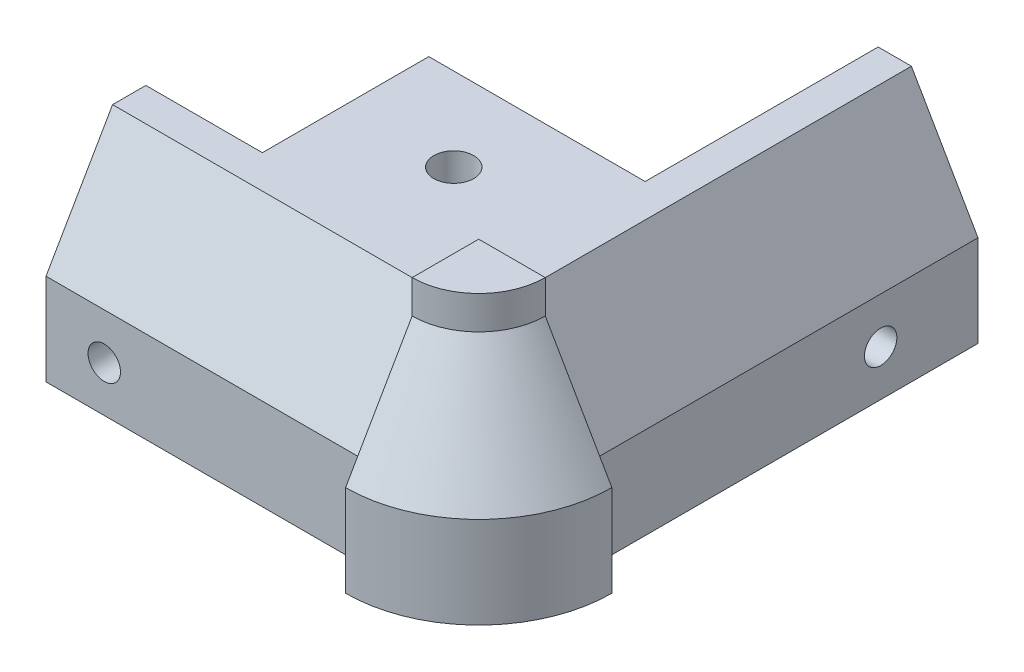
ISO-10303-21;
HEADER;
FILE_DESCRIPTION(('STEP AP214'),'2;1');
FILE_NAME('part.step','',(''),(''),'','','');
FILE_SCHEMA(('AUTOMOTIVE_DESIGN { 1 0 10303 214 1 1 1 1 }'));
ENDSEC;
DATA;
#1=APPLICATION_CONTEXT('core data for automotive mechanical design processes');
#2=APPLICATION_PROTOCOL_DEFINITION('international standard','automotive_design',2000,#1);
#3=PRODUCT_CONTEXT('',#1,'mechanical');
#4=PRODUCT('Part','Part','',(#3));
#5=PRODUCT_RELATED_PRODUCT_CATEGORY('part','',(#4));
#6=PRODUCT_DEFINITION_FORMATION('','',#4);
#7=PRODUCT_DEFINITION_CONTEXT('part definition',#1,'design');
#8=PRODUCT_DEFINITION('design','',#6,#7);
#9=PRODUCT_DEFINITION_SHAPE('','',#8);
#10=(LENGTH_UNIT() NAMED_UNIT(*) SI_UNIT(.MILLI.,.METRE.));
#11=(NAMED_UNIT(*) PLANE_ANGLE_UNIT() SI_UNIT($,.RADIAN.));
#12=(NAMED_UNIT(*) SI_UNIT($,.STERADIAN.) SOLID_ANGLE_UNIT());
#13=UNCERTAINTY_MEASURE_WITH_UNIT(LENGTH_MEASURE(1.E-05),#10,'distance_accuracy_value','');
#14=(GEOMETRIC_REPRESENTATION_CONTEXT(3) GLOBAL_UNCERTAINTY_ASSIGNED_CONTEXT((#13)) GLOBAL_UNIT_ASSIGNED_CONTEXT((#10,
#11,#12)) REPRESENTATION_CONTEXT('',''));
#15=CARTESIAN_POINT('',(0.,0.,0.));
#16=DIRECTION('',(0.,0.,1.));
#17=DIRECTION('',(1.,0.,0.));
#18=AXIS2_PLACEMENT_3D('',#15,#16,#17);
#19=CARTESIAN_POINT('',(-6.5,6.,5.));
#20=DIRECTION('',(1.,0.,0.));
#21=DIRECTION('',(0.,0.,-1.));
#22=AXIS2_PLACEMENT_3D('',#19,#20,#21);
#23=PLANE('',#22);
#24=DIRECTION('',(0.,-1.,0.));
#25=VECTOR('',#24,1.);
#26=CARTESIAN_POINT('',(-6.5,6.,5.));
#27=LINE('',#26,#25);
#28=CARTESIAN_POINT('',(-6.5,6.,5.));
#29=VERTEX_POINT('',#28);
#30=CARTESIAN_POINT('',(-6.5,0.,5.));
#31=VERTEX_POINT('',#30);
#32=EDGE_CURVE('E49',#29,#31,#27,.T.);
#33=ORIENTED_EDGE('',*,*,#32,.F.);
#34=DIRECTION('',(0.,0.,1.));
#35=VECTOR('',#34,1.);
#36=CARTESIAN_POINT('',(-6.5,6.,5.));
#37=LINE('',#36,#35);
#38=CARTESIAN_POINT('',(-6.5,6.,-5.));
#39=VERTEX_POINT('',#38);
#40=EDGE_CURVE('E290',#39,#29,#37,.T.);
#41=ORIENTED_EDGE('',*,*,#40,.F.);
#42=DIRECTION('',(0.,-1.,0.));
#43=VECTOR('',#42,1.);
#44=CARTESIAN_POINT('',(-6.5,6.,-5.));
#45=LINE('',#44,#43);
#46=CARTESIAN_POINT('',(-6.5,0.,-5.));
#47=VERTEX_POINT('',#46);
#48=EDGE_CURVE('E41',#39,#47,#45,.T.);
#49=ORIENTED_EDGE('',*,*,#48,.T.);
#50=DIRECTION('',(0.,0.,1.));
#51=VECTOR('',#50,1.);
#52=CARTESIAN_POINT('',(-6.5,0.,5.));
#53=LINE('',#52,#51);
#54=EDGE_CURVE('E287',#47,#31,#53,.T.);
#55=ORIENTED_EDGE('',*,*,#54,.T.);
#56=EDGE_LOOP('',(#33,#41,#49,#55));
#57=FACE_BOUND('',#56,.T.);
#58=ADVANCED_FACE('F33',(#57),#23,.F.);
#59=CARTESIAN_POINT('',(0.,6.,0.));
#60=DIRECTION('',(0.,1.,0.));
#61=DIRECTION('',(0.,0.,1.));
#62=AXIS2_PLACEMENT_3D('',#59,#60,#61);
#63=PLANE('',#62);
#64=ORIENTED_EDGE('',*,*,#40,.T.);
#65=DIRECTION('',(1.,0.,0.));
#66=VECTOR('',#65,1.);
#67=CARTESIAN_POINT('',(-13.5,6.,5.));
#68=LINE('',#67,#66);
#69=CARTESIAN_POINT('',(-13.5,6.,5.));
#70=VERTEX_POINT('',#69);
#71=EDGE_CURVE('E225',#70,#29,#68,.T.);
#72=ORIENTED_EDGE('',*,*,#71,.F.);
#73=DIRECTION('',(0.,0.,-1.));
#74=VECTOR('',#73,1.);
#75=CARTESIAN_POINT('',(-13.5,6.,7.));
#76=LINE('',#75,#74);
#77=CARTESIAN_POINT('',(-13.5,6.,7.));
#78=VERTEX_POINT('',#77);
#79=EDGE_CURVE('E205',#78,#70,#76,.T.);
#80=ORIENTED_EDGE('',*,*,#79,.F.);
#81=DIRECTION('',(-1.,0.,0.));
#82=VECTOR('',#81,1.);
#83=CARTESIAN_POINT('',(6.5,6.,7.));
#84=LINE('',#83,#82);
#85=CARTESIAN_POINT('',(6.5,6.,7.));
#86=VERTEX_POINT('',#85);
#87=EDGE_CURVE('E244',#86,#78,#84,.T.);
#88=ORIENTED_EDGE('',*,*,#87,.F.);
#89=DIRECTION('',(0.,0.,-1.));
#90=VECTOR('',#89,1.);
#91=CARTESIAN_POINT('',(6.5,6.,5.));
#92=LINE('',#91,#90);
#93=CARTESIAN_POINT('',(6.5,6.,5.));
#94=VERTEX_POINT('',#93);
#95=EDGE_CURVE('E241',#86,#94,#92,.T.);
#96=ORIENTED_EDGE('',*,*,#95,.T.);
#97=DIRECTION('',(1.,0.,0.));
#98=VECTOR('',#97,1.);
#99=CARTESIAN_POINT('',(6.5,6.,5.));
#100=LINE('',#99,#98);
#101=CARTESIAN_POINT('',(8.5,6.,5.));
#102=VERTEX_POINT('',#101);
#103=EDGE_CURVE('E173',#94,#102,#100,.T.);
#104=ORIENTED_EDGE('',*,*,#103,.T.);
#105=DIRECTION('',(0.,0.,1.));
#106=VECTOR('',#105,1.);
#107=CARTESIAN_POINT('',(8.5,6.,-19.));
#108=LINE('',#107,#106);
#109=CARTESIAN_POINT('',(8.5,6.,-19.));
#110=VERTEX_POINT('',#109);
#111=EDGE_CURVE('E274',#110,#102,#108,.T.);
#112=ORIENTED_EDGE('',*,*,#111,.F.);
#113=DIRECTION('',(-1.,0.,0.));
#114=VECTOR('',#113,1.);
#115=CARTESIAN_POINT('',(6.5,6.,-19.));
#116=LINE('',#115,#114);
#117=CARTESIAN_POINT('',(6.5,6.,-19.));
#118=VERTEX_POINT('',#117);
#119=EDGE_CURVE('E266',#110,#118,#116,.T.);
#120=ORIENTED_EDGE('',*,*,#119,.T.);
#121=DIRECTION('',(0.,0.,1.));
#122=VECTOR('',#121,1.);
#123=CARTESIAN_POINT('',(6.5,6.,-19.));
#124=LINE('',#123,#122);
#125=CARTESIAN_POINT('',(6.5,6.,-5.));
#126=VERTEX_POINT('',#125);
#127=EDGE_CURVE('E75',#118,#126,#124,.T.);
#128=ORIENTED_EDGE('',*,*,#127,.T.);
#129=DIRECTION('',(-1.,0.,0.));
#130=VECTOR('',#129,1.);
#131=CARTESIAN_POINT('',(6.5,6.,-5.));
#132=LINE('',#131,#130);
#133=EDGE_CURVE('E57',#126,#39,#132,.T.);
#134=ORIENTED_EDGE('',*,*,#133,.T.);
#135=EDGE_LOOP('',(#64,#72,#80,#88,#96,#104,#112,#120,#128,#134));
#136=FACE_BOUND('',#135,.T.);
#137=CARTESIAN_POINT('',(0.,6.,0.));
#138=DIRECTION('',(0.,1.,0.));
#139=DIRECTION('',(0.,0.,1.));
#140=AXIS2_PLACEMENT_3D('',#137,#138,#139);
#141=CIRCLE('',#140,1.2);
#142=CARTESIAN_POINT('',(0.,6.,1.2));
#143=VERTEX_POINT('',#142);
#144=EDGE_CURVE('E284',#143,#143,#141,.T.);
#145=ORIENTED_EDGE('',*,*,#144,.F.);
#146=EDGE_LOOP('',(#145));
#147=FACE_BOUND('',#146,.T.);
#148=ADVANCED_FACE('F356',(#136,#147),#63,.T.);
#149=CARTESIAN_POINT('',(0.,0.,0.));
#150=DIRECTION('',(0.,1.,0.));
#151=DIRECTION('',(0.,0.,1.));
#152=AXIS2_PLACEMENT_3D('',#149,#150,#151);
#153=PLANE('',#152);
#154=ORIENTED_EDGE('',*,*,#54,.F.);
#155=DIRECTION('',(-1.,0.,0.));
#156=VECTOR('',#155,1.);
#157=CARTESIAN_POINT('',(6.5,0.,-5.));
#158=LINE('',#157,#156);
#159=CARTESIAN_POINT('',(6.5,0.,-5.));
#160=VERTEX_POINT('',#159);
#161=EDGE_CURVE('E292',#160,#47,#158,.T.);
#162=ORIENTED_EDGE('',*,*,#161,.F.);
#163=DIRECTION('',(0.,0.,-1.));
#164=VECTOR('',#163,1.);
#165=CARTESIAN_POINT('',(6.5,0.,5.));
#166=LINE('',#165,#164);
#167=CARTESIAN_POINT('',(6.5,0.,7.));
#168=VERTEX_POINT('',#167);
#169=EDGE_CURVE('E70',#168,#160,#166,.T.);
#170=ORIENTED_EDGE('',*,*,#169,.F.);
#171=DIRECTION('',(-1.,0.,0.));
#172=VECTOR('',#171,1.);
#173=CARTESIAN_POINT('',(6.5,0.,7.));
#174=LINE('',#173,#172);
#175=CARTESIAN_POINT('',(-13.5,0.,7.));
#176=VERTEX_POINT('',#175);
#177=EDGE_CURVE('E243',#168,#176,#174,.T.);
#178=ORIENTED_EDGE('',*,*,#177,.T.);
#179=DIRECTION('',(0.,0.,1.));
#180=VECTOR('',#179,1.);
#181=CARTESIAN_POINT('',(-13.5,0.,5.));
#182=LINE('',#181,#180);
#183=CARTESIAN_POINT('',(-13.5,0.,5.));
#184=VERTEX_POINT('',#183);
#185=EDGE_CURVE('E209',#184,#176,#182,.T.);
#186=ORIENTED_EDGE('',*,*,#185,.F.);
#187=DIRECTION('',(1.,0.,0.));
#188=VECTOR('',#187,1.);
#189=CARTESIAN_POINT('',(-13.5,0.,5.));
#190=LINE('',#189,#188);
#191=EDGE_CURVE('E221',#184,#31,#190,.T.);
#192=ORIENTED_EDGE('',*,*,#191,.T.);
#193=EDGE_LOOP('',(#154,#162,#170,#178,#186,#192));
#194=FACE_BOUND('',#193,.T.);
#195=CARTESIAN_POINT('',(0.,0.,0.));
#196=DIRECTION('',(0.,1.,0.));
#197=DIRECTION('',(0.,0.,1.));
#198=AXIS2_PLACEMENT_3D('',#195,#196,#197);
#199=CIRCLE('',#198,1.2);
#200=CARTESIAN_POINT('',(0.,0.,1.2));
#201=VERTEX_POINT('',#200);
#202=EDGE_CURVE('E273',#201,#201,#199,.T.);
#203=ORIENTED_EDGE('',*,*,#202,.T.);
#204=EDGE_LOOP('',(#203));
#205=FACE_BOUND('',#204,.T.);
#206=ADVANCED_FACE('F335',(#194,#205),#153,.F.);
#207=CARTESIAN_POINT('',(6.5,6.,-5.));
#208=DIRECTION('',(0.,0.,1.));
#209=DIRECTION('',(1.,0.,0.));
#210=AXIS2_PLACEMENT_3D('',#207,#208,#209);
#211=PLANE('',#210);
#212=ORIENTED_EDGE('',*,*,#161,.T.);
#213=ORIENTED_EDGE('',*,*,#48,.F.);
#214=ORIENTED_EDGE('',*,*,#133,.F.);
#215=DIRECTION('',(0.,-1.,0.));
#216=VECTOR('',#215,1.);
#217=CARTESIAN_POINT('',(6.5,6.,-5.));
#218=LINE('',#217,#216);
#219=EDGE_CURVE('E11',#126,#160,#218,.T.);
#220=ORIENTED_EDGE('',*,*,#219,.T.);
#221=EDGE_LOOP('',(#212,#213,#214,#220));
#222=FACE_BOUND('',#221,.T.);
#223=ADVANCED_FACE('F347',(#222),#211,.F.);
#224=CARTESIAN_POINT('',(0.,6.,0.));
#225=DIRECTION('',(0.,-1.,0.));
#226=DIRECTION('',(0.,0.,-1.));
#227=AXIS2_PLACEMENT_3D('',#224,#225,#226);
#228=CYLINDRICAL_SURFACE('',#227,1.2);
#229=ORIENTED_EDGE('',*,*,#144,.T.);
#230=EDGE_LOOP('',(#229));
#231=FACE_BOUND('',#230,.T.);
#232=ORIENTED_EDGE('',*,*,#202,.F.);
#233=EDGE_LOOP('',(#232));
#234=FACE_BOUND('',#233,.T.);
#235=ADVANCED_FACE('F349',(#231,#234),#228,.F.);
#236=CARTESIAN_POINT('',(6.5,-6.42820323027551,-19.));
#237=DIRECTION('',(-1.,0.,0.));
#238=DIRECTION('',(0.,0.,1.));
#239=AXIS2_PLACEMENT_3D('',#236,#237,#238);
#240=PLANE('',#239);
#241=CARTESIAN_POINT('',(6.5,-3.67820323027552,-13.15));
#242=DIRECTION('',(-1.,0.,0.));
#243=DIRECTION('',(0.,0.,1.));
#244=AXIS2_PLACEMENT_3D('',#241,#242,#243);
#245=CIRCLE('',#244,0.975);
#246=CARTESIAN_POINT('',(6.5,-3.67820323027552,-12.175));
#247=VERTEX_POINT('',#246);
#248=EDGE_CURVE('E229',#247,#247,#245,.T.);
#249=ORIENTED_EDGE('',*,*,#248,.F.);
#250=EDGE_LOOP('',(#249));
#251=FACE_BOUND('',#250,.T.);
#252=DIRECTION('',(0.,0.,1.));
#253=VECTOR('',#252,1.);
#254=CARTESIAN_POINT('',(6.5,-6.42820323027551,-19.));
#255=LINE('',#254,#253);
#256=CARTESIAN_POINT('',(6.5,-6.42820323027551,-19.));
#257=VERTEX_POINT('',#256);
#258=CARTESIAN_POINT('',(6.5,-6.42820323027551,7.));
#259=VERTEX_POINT('',#258);
#260=EDGE_CURVE('E269',#257,#259,#255,.T.);
#261=ORIENTED_EDGE('',*,*,#260,.T.);
#262=DIRECTION('',(0.,-1.,0.));
#263=VECTOR('',#262,1.);
#264=CARTESIAN_POINT('',(6.5,0.,7.));
#265=LINE('',#264,#263);
#266=EDGE_CURVE('E232',#168,#259,#265,.T.);
#267=ORIENTED_EDGE('',*,*,#266,.F.);
#268=ORIENTED_EDGE('',*,*,#169,.T.);
#269=ORIENTED_EDGE('',*,*,#219,.F.);
#270=ORIENTED_EDGE('',*,*,#127,.F.);
#271=DIRECTION('',(0.,-1.,0.));
#272=VECTOR('',#271,1.);
#273=CARTESIAN_POINT('',(6.5,-6.42820323027551,-19.));
#274=LINE('',#273,#272);
#275=EDGE_CURVE('E254',#118,#257,#274,.T.);
#276=ORIENTED_EDGE('',*,*,#275,.T.);
#277=EDGE_LOOP('',(#261,#267,#268,#269,#270,#276));
#278=FACE_BOUND('',#277,.T.);
#279=ADVANCED_FACE('F326',(#251,#278),#240,.T.);
#280=CARTESIAN_POINT('',(8.5,6.,-19.));
#281=DIRECTION('',(0.86602540378444,0.499999999999998,0.));
#282=DIRECTION('',(-0.499999999999998,0.86602540378444,0.));
#283=AXIS2_PLACEMENT_3D('',#280,#281,#282);
#284=PLANE('',#283);
#285=DIRECTION('',(-0.499999999999998,0.86602540378444,0.));
#286=VECTOR('',#285,1.);
#287=CARTESIAN_POINT('',(8.5,6.,5.));
#288=LINE('',#287,#286);
#289=CARTESIAN_POINT('',(12.5,-0.928203230275516,5.));
#290=VERTEX_POINT('',#289);
#291=EDGE_CURVE('E257',#290,#102,#288,.T.);
#292=ORIENTED_EDGE('',*,*,#291,.F.);
#293=DIRECTION('',(0.,0.,1.));
#294=VECTOR('',#293,1.);
#295=CARTESIAN_POINT('',(12.5,-0.928203230275516,-19.));
#296=LINE('',#295,#294);
#297=CARTESIAN_POINT('',(12.5,-0.928203230275516,-19.));
#298=VERTEX_POINT('',#297);
#299=EDGE_CURVE('E277',#298,#290,#296,.T.);
#300=ORIENTED_EDGE('',*,*,#299,.F.);
#301=DIRECTION('',(-0.499999999999998,0.86602540378444,0.));
#302=VECTOR('',#301,1.);
#303=CARTESIAN_POINT('',(8.5,6.,-19.));
#304=LINE('',#303,#302);
#305=EDGE_CURVE('E263',#298,#110,#304,.T.);
#306=ORIENTED_EDGE('',*,*,#305,.T.);
#307=ORIENTED_EDGE('',*,*,#111,.T.);
#308=EDGE_LOOP('',(#292,#300,#306,#307));
#309=FACE_BOUND('',#308,.T.);
#310=ADVANCED_FACE('F308',(#309),#284,.T.);
#311=CARTESIAN_POINT('',(12.5,-0.928203230275516,-19.));
#312=DIRECTION('',(1.,0.,0.));
#313=DIRECTION('',(0.,0.,-1.));
#314=AXIS2_PLACEMENT_3D('',#311,#312,#313);
#315=PLANE('',#314);
#316=CARTESIAN_POINT('',(12.5,-3.67820323027552,-13.15));
#317=DIRECTION('',(1.,0.,0.));
#318=DIRECTION('',(0.,0.,-1.));
#319=AXIS2_PLACEMENT_3D('',#316,#317,#318);
#320=CIRCLE('',#319,0.975);
#321=CARTESIAN_POINT('',(12.5,-3.67820323027552,-14.125));
#322=VERTEX_POINT('',#321);
#323=EDGE_CURVE('E228',#322,#322,#320,.T.);
#324=ORIENTED_EDGE('',*,*,#323,.F.);
#325=EDGE_LOOP('',(#324));
#326=FACE_BOUND('',#325,.T.);
#327=DIRECTION('',(0.,1.,0.));
#328=VECTOR('',#327,1.);
#329=CARTESIAN_POINT('',(12.5,-0.928203230275516,5.));
#330=LINE('',#329,#328);
#331=CARTESIAN_POINT('',(12.5,-6.42820323027551,5.));
#332=VERTEX_POINT('',#331);
#333=EDGE_CURVE('E246',#332,#290,#330,.T.);
#334=ORIENTED_EDGE('',*,*,#333,.F.);
#335=DIRECTION('',(0.,0.,1.));
#336=VECTOR('',#335,1.);
#337=CARTESIAN_POINT('',(12.5,-6.42820323027552,-19.));
#338=LINE('',#337,#336);
#339=CARTESIAN_POINT('',(12.5,-6.42820323027552,-19.));
#340=VERTEX_POINT('',#339);
#341=EDGE_CURVE('E280',#340,#332,#338,.T.);
#342=ORIENTED_EDGE('',*,*,#341,.F.);
#343=DIRECTION('',(0.,1.,0.));
#344=VECTOR('',#343,1.);
#345=CARTESIAN_POINT('',(12.5,-0.928203230275516,-19.));
#346=LINE('',#345,#344);
#347=EDGE_CURVE('E260',#340,#298,#346,.T.);
#348=ORIENTED_EDGE('',*,*,#347,.T.);
#349=ORIENTED_EDGE('',*,*,#299,.T.);
#350=EDGE_LOOP('',(#334,#342,#348,#349));
#351=FACE_BOUND('',#350,.T.);
#352=ADVANCED_FACE('F304',(#326,#351),#315,.T.);
#353=CARTESIAN_POINT('',(12.5,-6.42820323027552,-19.));
#354=DIRECTION('',(0.,-1.,0.));
#355=DIRECTION('',(1.,0.,0.));
#356=AXIS2_PLACEMENT_3D('',#353,#354,#355);
#357=PLANE('',#356);
#358=ORIENTED_EDGE('',*,*,#341,.T.);
#359=DIRECTION('',(1.,0.,0.));
#360=VECTOR('',#359,1.);
#361=CARTESIAN_POINT('',(6.5,-6.42820323027551,5.));
#362=LINE('',#361,#360);
#363=CARTESIAN_POINT('',(14.5,-6.42820323027551,5.));
#364=VERTEX_POINT('',#363);
#365=EDGE_CURVE('E176',#332,#364,#362,.T.);
#366=ORIENTED_EDGE('',*,*,#365,.T.);
#367=CARTESIAN_POINT('',(6.5,-6.42820323027552,5.));
#368=DIRECTION('',(0.,-1.,0.));
#369=DIRECTION('',(1.,0.,0.));
#370=AXIS2_PLACEMENT_3D('',#367,#368,#369);
#371=CIRCLE('',#370,7.99999999999999);
#372=CARTESIAN_POINT('',(6.5,-6.42820323027552,13.));
#373=VERTEX_POINT('',#372);
#374=EDGE_CURVE('E193',#364,#373,#371,.T.);
#375=ORIENTED_EDGE('',*,*,#374,.T.);
#376=DIRECTION('',(0.,0.,1.));
#377=VECTOR('',#376,1.);
#378=CARTESIAN_POINT('',(6.5,-6.42820323027551,5.));
#379=LINE('',#378,#377);
#380=CARTESIAN_POINT('',(6.5,-6.42820323027551,11.));
#381=VERTEX_POINT('',#380);
#382=EDGE_CURVE('E190',#381,#373,#379,.T.);
#383=ORIENTED_EDGE('',*,*,#382,.F.);
#384=DIRECTION('',(-1.,0.,0.));
#385=VECTOR('',#384,1.);
#386=CARTESIAN_POINT('',(6.5,-6.42820323027552,11.));
#387=LINE('',#386,#385);
#388=CARTESIAN_POINT('',(-13.5,-6.42820323027552,11.));
#389=VERTEX_POINT('',#388);
#390=EDGE_CURVE('E249',#381,#389,#387,.T.);
#391=ORIENTED_EDGE('',*,*,#390,.T.);
#392=DIRECTION('',(0.,0.,1.));
#393=VECTOR('',#392,1.);
#394=CARTESIAN_POINT('',(-13.5,-6.42820323027552,7.));
#395=LINE('',#394,#393);
#396=CARTESIAN_POINT('',(-13.5,-6.42820323027552,7.));
#397=VERTEX_POINT('',#396);
#398=EDGE_CURVE('E215',#397,#389,#395,.T.);
#399=ORIENTED_EDGE('',*,*,#398,.F.);
#400=DIRECTION('',(-1.,0.,0.));
#401=VECTOR('',#400,1.);
#402=CARTESIAN_POINT('',(6.5,-6.42820323027552,7.));
#403=LINE('',#402,#401);
#404=EDGE_CURVE('E251',#259,#397,#403,.T.);
#405=ORIENTED_EDGE('',*,*,#404,.F.);
#406=ORIENTED_EDGE('',*,*,#260,.F.);
#407=DIRECTION('',(1.,0.,0.));
#408=VECTOR('',#407,1.);
#409=CARTESIAN_POINT('',(12.5,-6.42820323027552,-19.));
#410=LINE('',#409,#408);
#411=EDGE_CURVE('E256',#257,#340,#410,.T.);
#412=ORIENTED_EDGE('',*,*,#411,.T.);
#413=EDGE_LOOP('',(#358,#366,#375,#383,#391,#399,#405,#406,#412));
#414=FACE_BOUND('',#413,.T.);
#415=ADVANCED_FACE('F307',(#414),#357,.T.);
#416=CARTESIAN_POINT('',(0.,0.,-19.));
#417=DIRECTION('',(0.,0.,-1.));
#418=DIRECTION('',(-1.,0.,0.));
#419=AXIS2_PLACEMENT_3D('',#416,#417,#418);
#420=PLANE('',#419);
#421=ORIENTED_EDGE('',*,*,#275,.F.);
#422=ORIENTED_EDGE('',*,*,#119,.F.);
#423=ORIENTED_EDGE('',*,*,#305,.F.);
#424=ORIENTED_EDGE('',*,*,#347,.F.);
#425=ORIENTED_EDGE('',*,*,#411,.F.);
#426=EDGE_LOOP('',(#421,#422,#423,#424,#425));
#427=FACE_BOUND('',#426,.T.);
#428=ADVANCED_FACE('F323',(#427),#420,.T.);
#429=CARTESIAN_POINT('',(6.5,6.,7.));
#430=DIRECTION('',(0.,0.499999999999998,0.86602540378444));
#431=DIRECTION('',(0.,-0.86602540378444,0.499999999999998));
#432=AXIS2_PLACEMENT_3D('',#429,#430,#431);
#433=PLANE('',#432);
#434=ORIENTED_EDGE('',*,*,#87,.T.);
#435=DIRECTION('',(0.,0.86602540378444,-0.499999999999998));
#436=VECTOR('',#435,1.);
#437=CARTESIAN_POINT('',(-13.5,-0.928203230275517,11.));
#438=LINE('',#437,#436);
#439=CARTESIAN_POINT('',(-13.5,-0.928203230275517,11.));
#440=VERTEX_POINT('',#439);
#441=EDGE_CURVE('E202',#440,#78,#438,.T.);
#442=ORIENTED_EDGE('',*,*,#441,.F.);
#443=DIRECTION('',(-1.,0.,0.));
#444=VECTOR('',#443,1.);
#445=CARTESIAN_POINT('',(6.5,-0.928203230275517,11.));
#446=LINE('',#445,#444);
#447=CARTESIAN_POINT('',(6.5,-0.928203230275517,11.));
#448=VERTEX_POINT('',#447);
#449=EDGE_CURVE('E247',#448,#440,#446,.T.);
#450=ORIENTED_EDGE('',*,*,#449,.F.);
#451=DIRECTION('',(0.,0.86602540378444,-0.499999999999998));
#452=VECTOR('',#451,1.);
#453=CARTESIAN_POINT('',(6.5,6.,7.));
#454=LINE('',#453,#452);
#455=EDGE_CURVE('E238',#448,#86,#454,.T.);
#456=ORIENTED_EDGE('',*,*,#455,.T.);
#457=EDGE_LOOP('',(#434,#442,#450,#456));
#458=FACE_BOUND('',#457,.T.);
#459=ADVANCED_FACE('F377',(#458),#433,.T.);
#460=CARTESIAN_POINT('',(6.5,-0.928203230275517,11.));
#461=DIRECTION('',(0.,0.,1.));
#462=DIRECTION('',(1.,0.,0.));
#463=AXIS2_PLACEMENT_3D('',#460,#461,#462);
#464=PLANE('',#463);
#465=CARTESIAN_POINT('',(-10.,-3.67820323027552,11.));
#466=DIRECTION('',(0.,0.,1.));
#467=DIRECTION('',(1.,0.,0.));
#468=AXIS2_PLACEMENT_3D('',#465,#466,#467);
#469=CIRCLE('',#468,0.975);
#470=CARTESIAN_POINT('',(-9.025,-3.67820323027552,11.));
#471=VERTEX_POINT('',#470);
#472=EDGE_CURVE('E186',#471,#471,#469,.T.);
#473=ORIENTED_EDGE('',*,*,#472,.F.);
#474=EDGE_LOOP('',(#473));
#475=FACE_BOUND('',#474,.T.);
#476=ORIENTED_EDGE('',*,*,#449,.T.);
#477=DIRECTION('',(0.,1.,0.));
#478=VECTOR('',#477,1.);
#479=CARTESIAN_POINT('',(-13.5,-6.42820323027552,11.));
#480=LINE('',#479,#478);
#481=EDGE_CURVE('E218',#389,#440,#480,.T.);
#482=ORIENTED_EDGE('',*,*,#481,.F.);
#483=ORIENTED_EDGE('',*,*,#390,.F.);
#484=DIRECTION('',(0.,1.,0.));
#485=VECTOR('',#484,1.);
#486=CARTESIAN_POINT('',(6.5,-0.928203230275517,11.));
#487=LINE('',#486,#485);
#488=EDGE_CURVE('E235',#381,#448,#487,.T.);
#489=ORIENTED_EDGE('',*,*,#488,.T.);
#490=EDGE_LOOP('',(#476,#482,#483,#489));
#491=FACE_BOUND('',#490,.T.);
#492=ADVANCED_FACE('F380',(#475,#491),#464,.T.);
#493=CARTESIAN_POINT('',(6.5,0.,7.));
#494=DIRECTION('',(0.,0.,-1.));
#495=DIRECTION('',(0.,1.,0.));
#496=AXIS2_PLACEMENT_3D('',#493,#494,#495);
#497=PLANE('',#496);
#498=CARTESIAN_POINT('',(-10.,-3.67820323027552,7.));
#499=DIRECTION('',(0.,0.,-1.));
#500=DIRECTION('',(0.,1.,0.));
#501=AXIS2_PLACEMENT_3D('',#498,#499,#500);
#502=CIRCLE('',#501,0.975);
#503=CARTESIAN_POINT('',(-10.,-2.70320323027552,7.));
#504=VERTEX_POINT('',#503);
#505=EDGE_CURVE('E36',#504,#504,#502,.T.);
#506=ORIENTED_EDGE('',*,*,#505,.F.);
#507=EDGE_LOOP('',(#506));
#508=FACE_BOUND('',#507,.T.);
#509=ORIENTED_EDGE('',*,*,#404,.T.);
#510=DIRECTION('',(0.,-1.,0.));
#511=VECTOR('',#510,1.);
#512=CARTESIAN_POINT('',(-13.5,0.,7.));
#513=LINE('',#512,#511);
#514=EDGE_CURVE('E212',#176,#397,#513,.T.);
#515=ORIENTED_EDGE('',*,*,#514,.F.);
#516=ORIENTED_EDGE('',*,*,#177,.F.);
#517=ORIENTED_EDGE('',*,*,#266,.T.);
#518=EDGE_LOOP('',(#509,#515,#516,#517));
#519=FACE_BOUND('',#518,.T.);
#520=ADVANCED_FACE('F331',(#508,#519),#497,.T.);
#521=CARTESIAN_POINT('',(-6.5,-3.67820323027552,-13.15));
#522=DIRECTION('',(1.,0.,0.));
#523=DIRECTION('',(0.,0.,-1.));
#524=AXIS2_PLACEMENT_3D('',#521,#522,#523);
#525=CYLINDRICAL_SURFACE('',#524,0.975);
#526=ORIENTED_EDGE('',*,*,#248,.T.);
#527=EDGE_LOOP('',(#526));
#528=FACE_BOUND('',#527,.T.);
#529=ORIENTED_EDGE('',*,*,#323,.T.);
#530=EDGE_LOOP('',(#529));
#531=FACE_BOUND('',#530,.T.);
#532=ADVANCED_FACE('F302',(#528,#531),#525,.F.);
#533=CARTESIAN_POINT('',(-13.5,6.,5.));
#534=DIRECTION('',(0.,0.,1.));
#535=DIRECTION('',(1.,0.,0.));
#536=AXIS2_PLACEMENT_3D('',#533,#534,#535);
#537=PLANE('',#536);
#538=ORIENTED_EDGE('',*,*,#32,.T.);
#539=ORIENTED_EDGE('',*,*,#191,.F.);
#540=DIRECTION('',(0.,-1.,0.));
#541=VECTOR('',#540,1.);
#542=CARTESIAN_POINT('',(-13.5,6.,5.));
#543=LINE('',#542,#541);
#544=EDGE_CURVE('E207',#70,#184,#543,.T.);
#545=ORIENTED_EDGE('',*,*,#544,.F.);
#546=ORIENTED_EDGE('',*,*,#71,.T.);
#547=EDGE_LOOP('',(#538,#539,#545,#546));
#548=FACE_BOUND('',#547,.T.);
#549=ADVANCED_FACE('F345',(#548),#537,.F.);
#550=CARTESIAN_POINT('',(-13.5,0.,0.));
#551=DIRECTION('',(-1.,0.,0.));
#552=DIRECTION('',(0.,0.,1.));
#553=AXIS2_PLACEMENT_3D('',#550,#551,#552);
#554=PLANE('',#553);
#555=ORIENTED_EDGE('',*,*,#441,.T.);
#556=ORIENTED_EDGE('',*,*,#79,.T.);
#557=ORIENTED_EDGE('',*,*,#544,.T.);
#558=ORIENTED_EDGE('',*,*,#185,.T.);
#559=ORIENTED_EDGE('',*,*,#514,.T.);
#560=ORIENTED_EDGE('',*,*,#398,.T.);
#561=ORIENTED_EDGE('',*,*,#481,.T.);
#562=EDGE_LOOP('',(#555,#556,#557,#558,#559,#560,#561));
#563=FACE_BOUND('',#562,.T.);
#564=ADVANCED_FACE('F339',(#563),#554,.T.);
#565=CARTESIAN_POINT('',(-10.,-3.67820323027552,-19.));
#566=DIRECTION('',(0.,0.,1.));
#567=DIRECTION('',(1.,0.,0.));
#568=AXIS2_PLACEMENT_3D('',#565,#566,#567);
#569=CYLINDRICAL_SURFACE('',#568,0.975);
#570=ORIENTED_EDGE('',*,*,#505,.T.);
#571=EDGE_LOOP('',(#570));
#572=FACE_BOUND('',#571,.T.);
#573=ORIENTED_EDGE('',*,*,#472,.T.);
#574=EDGE_LOOP('',(#573));
#575=FACE_BOUND('',#574,.T.);
#576=ADVANCED_FACE('F395',(#572,#575),#569,.F.);
#577=CARTESIAN_POINT('',(6.5,0.,-1.5));
#578=DIRECTION('',(-1.,0.,0.));
#579=DIRECTION('',(0.,0.,1.));
#580=AXIS2_PLACEMENT_3D('',#577,#578,#579);
#581=PLANE('',#580);
#582=ORIENTED_EDGE('',*,*,#488,.F.);
#583=ORIENTED_EDGE('',*,*,#382,.T.);
#584=DIRECTION('',(0.,1.,0.));
#585=VECTOR('',#584,1.);
#586=CARTESIAN_POINT('',(6.5,-6.42820323027551,13.));
#587=LINE('',#586,#585);
#588=CARTESIAN_POINT('',(6.5,-0.928203230275516,13.));
#589=VERTEX_POINT('',#588);
#590=EDGE_CURVE('E422',#373,#589,#587,.T.);
#591=ORIENTED_EDGE('',*,*,#590,.T.);
#592=DIRECTION('',(0.,0.866025403784439,-0.5));
#593=VECTOR('',#592,1.);
#594=CARTESIAN_POINT('',(6.5,-0.928203230275516,13.));
#595=LINE('',#594,#593);
#596=CARTESIAN_POINT('',(6.5,6.,8.99999999999998));
#597=VERTEX_POINT('',#596);
#598=EDGE_CURVE('E425',#589,#597,#595,.T.);
#599=ORIENTED_EDGE('',*,*,#598,.T.);
#600=DIRECTION('',(0.,1.,0.));
#601=VECTOR('',#600,1.);
#602=CARTESIAN_POINT('',(6.5,6.,8.99999999999998));
#603=LINE('',#602,#601);
#604=CARTESIAN_POINT('',(6.5,8.,8.99999999999998));
#605=VERTEX_POINT('',#604);
#606=EDGE_CURVE('E182',#597,#605,#603,.T.);
#607=ORIENTED_EDGE('',*,*,#606,.T.);
#608=DIRECTION('',(0.,0.,-1.));
#609=VECTOR('',#608,1.);
#610=CARTESIAN_POINT('',(6.5,8.,8.99999999999998));
#611=LINE('',#610,#609);
#612=CARTESIAN_POINT('',(6.5,8.,5.));
#613=VERTEX_POINT('',#612);
#614=EDGE_CURVE('E179',#605,#613,#611,.T.);
#615=ORIENTED_EDGE('',*,*,#614,.T.);
#616=DIRECTION('',(0.,-1.,0.));
#617=VECTOR('',#616,1.);
#618=CARTESIAN_POINT('',(6.5,8.,5.));
#619=LINE('',#618,#617);
#620=EDGE_CURVE('E166',#613,#94,#619,.T.);
#621=ORIENTED_EDGE('',*,*,#620,.T.);
#622=ORIENTED_EDGE('',*,*,#95,.F.);
#623=ORIENTED_EDGE('',*,*,#455,.F.);
#624=EDGE_LOOP('',(#582,#583,#591,#599,#607,#615,#621,#622,#623));
#625=FACE_BOUND('',#624,.T.);
#626=ADVANCED_FACE('F180',(#625),#581,.T.);
#627=CARTESIAN_POINT('',(0.,0.,5.));
#628=DIRECTION('',(0.,0.,1.));
#629=DIRECTION('',(1.,0.,0.));
#630=AXIS2_PLACEMENT_3D('',#627,#628,#629);
#631=PLANE('',#630);
#632=ORIENTED_EDGE('',*,*,#365,.F.);
#633=ORIENTED_EDGE('',*,*,#333,.T.);
#634=ORIENTED_EDGE('',*,*,#291,.T.);
#635=ORIENTED_EDGE('',*,*,#103,.F.);
#636=ORIENTED_EDGE('',*,*,#620,.F.);
#637=DIRECTION('',(-1.,0.,0.));
#638=VECTOR('',#637,1.);
#639=CARTESIAN_POINT('',(10.5,8.,5.));
#640=LINE('',#639,#638);
#641=CARTESIAN_POINT('',(10.5,8.,5.));
#642=VERTEX_POINT('',#641);
#643=EDGE_CURVE('E170',#642,#613,#640,.T.);
#644=ORIENTED_EDGE('',*,*,#643,.F.);
#645=DIRECTION('',(0.,1.,0.));
#646=VECTOR('',#645,1.);
#647=CARTESIAN_POINT('',(10.5,6.,5.));
#648=LINE('',#647,#646);
#649=CARTESIAN_POINT('',(10.5,6.,5.));
#650=VERTEX_POINT('',#649);
#651=EDGE_CURVE('E191',#650,#642,#648,.T.);
#652=ORIENTED_EDGE('',*,*,#651,.F.);
#653=DIRECTION('',(-0.5,0.866025403784439,0.));
#654=VECTOR('',#653,1.);
#655=CARTESIAN_POINT('',(14.5,-0.928203230275516,5.));
#656=LINE('',#655,#654);
#657=CARTESIAN_POINT('',(14.5,-0.928203230275516,5.));
#658=VERTEX_POINT('',#657);
#659=EDGE_CURVE('E195',#658,#650,#656,.T.);
#660=ORIENTED_EDGE('',*,*,#659,.F.);
#661=DIRECTION('',(0.,1.,0.));
#662=VECTOR('',#661,1.);
#663=CARTESIAN_POINT('',(14.5,-6.42820323027551,5.));
#664=LINE('',#663,#662);
#665=EDGE_CURVE('E315',#364,#658,#664,.T.);
#666=ORIENTED_EDGE('',*,*,#665,.F.);
#667=EDGE_LOOP('',(#632,#633,#634,#635,#636,#644,#652,#660,#666));
#668=FACE_BOUND('',#667,.T.);
#669=ADVANCED_FACE('F168',(#668),#631,.F.);
#670=CARTESIAN_POINT('',(6.5,6.,5.));
#671=DIRECTION('',(0.,-1.,0.));
#672=DIRECTION('',(0.,0.,-1.));
#673=AXIS2_PLACEMENT_3D('',#670,#671,#672);
#674=CYLINDRICAL_SURFACE('',#673,7.99999999999999);
#675=CARTESIAN_POINT('',(6.5,-0.928203230275516,5.));
#676=DIRECTION('',(0.,-1.,0.));
#677=DIRECTION('',(1.,0.,0.));
#678=AXIS2_PLACEMENT_3D('',#675,#676,#677);
#679=CIRCLE('',#678,7.99999999999999);
#680=EDGE_CURVE('E421',#658,#589,#679,.T.);
#681=ORIENTED_EDGE('',*,*,#680,.T.);
#682=ORIENTED_EDGE('',*,*,#590,.F.);
#683=ORIENTED_EDGE('',*,*,#374,.F.);
#684=ORIENTED_EDGE('',*,*,#665,.T.);
#685=EDGE_LOOP('',(#681,#682,#683,#684));
#686=FACE_BOUND('',#685,.T.);
#687=ADVANCED_FACE('F401',(#686),#674,.T.);
#688=CARTESIAN_POINT('',(6.5,-0.928203230275516,5.));
#689=DIRECTION('',(0.,-1.,0.));
#690=DIRECTION('',(0.,0.,-1.));
#691=AXIS2_PLACEMENT_3D('',#688,#689,#690);
#692=CONICAL_SURFACE('',#691,7.99999999999999,0.523598775598299);
#693=CARTESIAN_POINT('',(6.5,6.,5.));
#694=DIRECTION('',(0.,-1.,0.));
#695=DIRECTION('',(1.,0.,0.));
#696=AXIS2_PLACEMENT_3D('',#693,#694,#695);
#697=CIRCLE('',#696,3.99999999999998);
#698=EDGE_CURVE('E427',#650,#597,#697,.T.);
#699=ORIENTED_EDGE('',*,*,#698,.T.);
#700=ORIENTED_EDGE('',*,*,#598,.F.);
#701=ORIENTED_EDGE('',*,*,#680,.F.);
#702=ORIENTED_EDGE('',*,*,#659,.T.);
#703=EDGE_LOOP('',(#699,#700,#701,#702));
#704=FACE_BOUND('',#703,.T.);
#705=ADVANCED_FACE('F409',(#704),#692,.T.);
#706=CARTESIAN_POINT('',(6.5,6.,5.));
#707=DIRECTION('',(0.,-1.,0.));
#708=DIRECTION('',(0.,0.,-1.));
#709=AXIS2_PLACEMENT_3D('',#706,#707,#708);
#710=CYLINDRICAL_SURFACE('',#709,3.99999999999998);
#711=CARTESIAN_POINT('',(6.5,8.,5.));
#712=DIRECTION('',(0.,-1.,0.));
#713=DIRECTION('',(1.,0.,0.));
#714=AXIS2_PLACEMENT_3D('',#711,#712,#713);
#715=CIRCLE('',#714,3.99999999999998);
#716=EDGE_CURVE('E187',#642,#605,#715,.T.);
#717=ORIENTED_EDGE('',*,*,#716,.T.);
#718=ORIENTED_EDGE('',*,*,#606,.F.);
#719=ORIENTED_EDGE('',*,*,#698,.F.);
#720=ORIENTED_EDGE('',*,*,#651,.T.);
#721=EDGE_LOOP('',(#717,#718,#719,#720));
#722=FACE_BOUND('',#721,.T.);
#723=ADVANCED_FACE('F406',(#722),#710,.T.);
#724=CARTESIAN_POINT('',(10.5,8.,5.));
#725=DIRECTION('',(0.,1.,0.));
#726=DIRECTION('',(0.,0.,1.));
#727=AXIS2_PLACEMENT_3D('',#724,#725,#726);
#728=PLANE('',#727);
#729=ORIENTED_EDGE('',*,*,#614,.F.);
#730=ORIENTED_EDGE('',*,*,#716,.F.);
#731=ORIENTED_EDGE('',*,*,#643,.T.);
#732=EDGE_LOOP('',(#729,#730,#731));
#733=FACE_BOUND('',#732,.T.);
#734=ADVANCED_FACE('F189',(#733),#728,.T.);
#735=CLOSED_SHELL('',(#58,#148,#206,#223,#235,#279,#310,#352,#415,#428,#459,#492,#520,#532,#549,
#564,#576,#626,#669,#687,#705,#723,#734));
#736=MANIFOLD_SOLID_BREP('B2',#735);
#737=ADVANCED_BREP_SHAPE_REPRESENTATION('',(#18,#736),#14);
#738=SHAPE_DEFINITION_REPRESENTATION(#9,#737);
ENDSEC;
END-ISO-10303-21;
